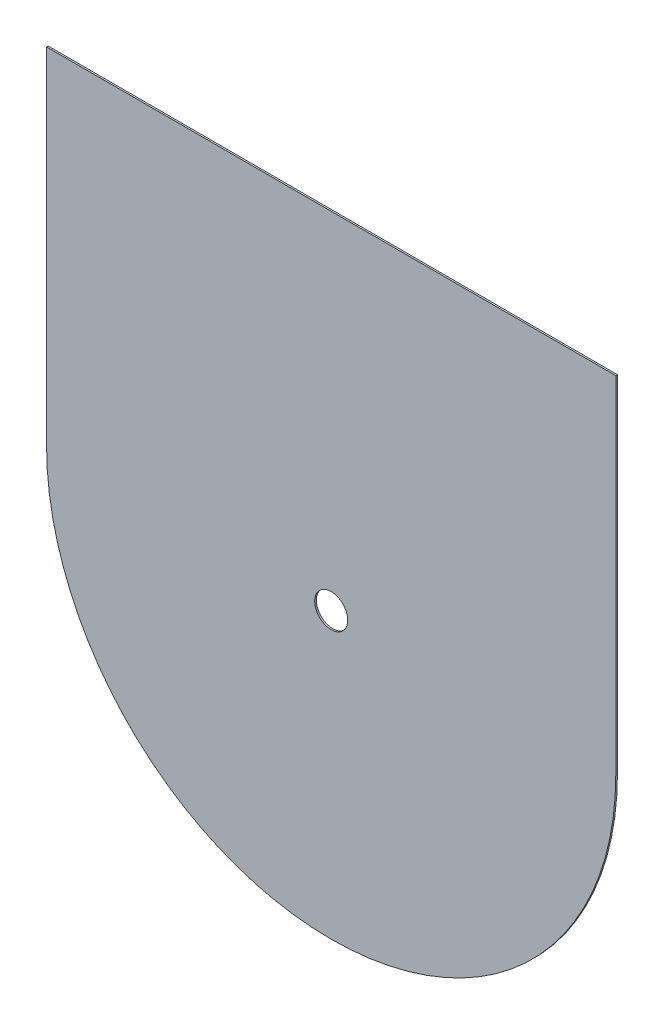
ISO-10303-21;
HEADER;
FILE_DESCRIPTION(('STEP AP214'),'2;1');
FILE_NAME('part.step','',(''),(''),'','','');
FILE_SCHEMA(('AUTOMOTIVE_DESIGN { 1 0 10303 214 1 1 1 1 }'));
ENDSEC;
DATA;
#1=APPLICATION_CONTEXT('core data for automotive mechanical design processes');
#2=APPLICATION_PROTOCOL_DEFINITION('international standard','automotive_design',2000,#1);
#3=PRODUCT_CONTEXT('',#1,'mechanical');
#4=PRODUCT('Part','Part','',(#3));
#5=PRODUCT_RELATED_PRODUCT_CATEGORY('part','',(#4));
#6=PRODUCT_DEFINITION_FORMATION('','',#4);
#7=PRODUCT_DEFINITION_CONTEXT('part definition',#1,'design');
#8=PRODUCT_DEFINITION('design','',#6,#7);
#9=PRODUCT_DEFINITION_SHAPE('','',#8);
#10=(LENGTH_UNIT() NAMED_UNIT(*) SI_UNIT(.MILLI.,.METRE.));
#11=(NAMED_UNIT(*) PLANE_ANGLE_UNIT() SI_UNIT($,.RADIAN.));
#12=(NAMED_UNIT(*) SI_UNIT($,.STERADIAN.) SOLID_ANGLE_UNIT());
#13=UNCERTAINTY_MEASURE_WITH_UNIT(LENGTH_MEASURE(1.E-05),#10,'distance_accuracy_value','');
#14=(GEOMETRIC_REPRESENTATION_CONTEXT(3) GLOBAL_UNCERTAINTY_ASSIGNED_CONTEXT((#13)) GLOBAL_UNIT_ASSIGNED_CONTEXT((#10,
#11,#12)) REPRESENTATION_CONTEXT('',''));
#15=CARTESIAN_POINT('',(0.,0.,0.));
#16=DIRECTION('',(0.,0.,1.));
#17=DIRECTION('',(1.,0.,0.));
#18=AXIS2_PLACEMENT_3D('',#15,#16,#17);
#19=CARTESIAN_POINT('',(0.,412.038787590789,2.));
#20=DIRECTION('',(0.,1.,0.));
#21=DIRECTION('',(0.,0.,1.));
#22=AXIS2_PLACEMENT_3D('',#19,#20,#21);
#23=PLANE('',#22);
#24=DIRECTION('',(1.,0.,0.));
#25=VECTOR('',#24,1.);
#26=CARTESIAN_POINT('',(0.,412.038787590789,0.));
#27=LINE('',#26,#25);
#28=CARTESIAN_POINT('',(-375.902130633059,412.038787590789,0.));
#29=VERTEX_POINT('',#28);
#30=CARTESIAN_POINT('',(313.897869366941,412.038787590789,0.));
#31=VERTEX_POINT('',#30);
#32=EDGE_CURVE('E115',#29,#31,#27,.T.);
#33=ORIENTED_EDGE('',*,*,#32,.F.);
#34=DIRECTION('',(0.,0.,-1.));
#35=VECTOR('',#34,1.);
#36=CARTESIAN_POINT('',(-375.902130633059,412.038787590789,2.));
#37=LINE('',#36,#35);
#38=CARTESIAN_POINT('',(-375.902130633059,412.038787590789,2.));
#39=VERTEX_POINT('',#38);
#40=EDGE_CURVE('E11',#39,#29,#37,.T.);
#41=ORIENTED_EDGE('',*,*,#40,.F.);
#42=DIRECTION('',(1.,0.,0.));
#43=VECTOR('',#42,1.);
#44=CARTESIAN_POINT('',(0.,412.038787590789,2.));
#45=LINE('',#44,#43);
#46=CARTESIAN_POINT('',(313.897869366941,412.038787590789,2.));
#47=VERTEX_POINT('',#46);
#48=EDGE_CURVE('E102',#39,#47,#45,.T.);
#49=ORIENTED_EDGE('',*,*,#48,.T.);
#50=DIRECTION('',(0.,0.,-1.));
#51=VECTOR('',#50,1.);
#52=CARTESIAN_POINT('',(313.897869366941,412.038787590789,2.));
#53=LINE('',#52,#51);
#54=EDGE_CURVE('E80',#47,#31,#53,.T.);
#55=ORIENTED_EDGE('',*,*,#54,.T.);
#56=EDGE_LOOP('',(#33,#41,#49,#55));
#57=FACE_BOUND('',#56,.T.);
#58=ADVANCED_FACE('F41',(#57),#23,.T.);
#59=CARTESIAN_POINT('',(-375.902130633059,0.,2.));
#60=DIRECTION('',(-1.,0.,0.));
#61=DIRECTION('',(0.,0.,1.));
#62=AXIS2_PLACEMENT_3D('',#59,#60,#61);
#63=PLANE('',#62);
#64=DIRECTION('',(0.,1.,0.));
#65=VECTOR('',#64,1.);
#66=CARTESIAN_POINT('',(-375.902130633059,0.,0.));
#67=LINE('',#66,#65);
#68=CARTESIAN_POINT('',(-375.902130633059,-7.06121240921128,0.));
#69=VERTEX_POINT('',#68);
#70=EDGE_CURVE('E93',#69,#29,#67,.T.);
#71=ORIENTED_EDGE('',*,*,#70,.F.);
#72=DIRECTION('',(0.,0.,-1.));
#73=VECTOR('',#72,1.);
#74=CARTESIAN_POINT('',(-375.902130633059,-7.06121240921128,2.));
#75=LINE('',#74,#73);
#76=CARTESIAN_POINT('',(-375.902130633059,-7.06121240921128,2.));
#77=VERTEX_POINT('',#76);
#78=EDGE_CURVE('E50',#77,#69,#75,.T.);
#79=ORIENTED_EDGE('',*,*,#78,.F.);
#80=DIRECTION('',(0.,1.,0.));
#81=VECTOR('',#80,1.);
#82=CARTESIAN_POINT('',(-375.902130633059,0.,2.));
#83=LINE('',#82,#81);
#84=EDGE_CURVE('E91',#77,#39,#83,.T.);
#85=ORIENTED_EDGE('',*,*,#84,.T.);
#86=ORIENTED_EDGE('',*,*,#40,.T.);
#87=EDGE_LOOP('',(#71,#79,#85,#86));
#88=FACE_BOUND('',#87,.T.);
#89=ADVANCED_FACE('F89',(#88),#63,.T.);
#90=CARTESIAN_POINT('',(-31.0021306330589,-7.06121240921128,2.));
#91=DIRECTION('',(0.,0.,-1.));
#92=DIRECTION('',(-1.,0.,0.));
#93=AXIS2_PLACEMENT_3D('',#90,#91,#92);
#94=CYLINDRICAL_SURFACE('',#93,344.9);
#95=CARTESIAN_POINT('',(-31.0021306330589,-7.06121240921128,0.));
#96=DIRECTION('',(0.,0.,1.));
#97=DIRECTION('',(1.,0.,0.));
#98=AXIS2_PLACEMENT_3D('',#95,#96,#97);
#99=CIRCLE('',#98,344.9);
#100=CARTESIAN_POINT('',(313.897869366941,-7.06121240921128,0.));
#101=VERTEX_POINT('',#100);
#102=EDGE_CURVE('E73',#69,#101,#99,.T.);
#103=ORIENTED_EDGE('',*,*,#102,.T.);
#104=DIRECTION('',(0.,0.,-1.));
#105=VECTOR('',#104,1.);
#106=CARTESIAN_POINT('',(313.897869366941,-7.06121240921128,2.));
#107=LINE('',#106,#105);
#108=CARTESIAN_POINT('',(313.897869366941,-7.06121240921128,2.));
#109=VERTEX_POINT('',#108);
#110=EDGE_CURVE('E95',#109,#101,#107,.T.);
#111=ORIENTED_EDGE('',*,*,#110,.F.);
#112=CARTESIAN_POINT('',(-31.0021306330589,-7.06121240921128,2.));
#113=DIRECTION('',(0.,0.,1.));
#114=DIRECTION('',(1.,0.,0.));
#115=AXIS2_PLACEMENT_3D('',#112,#113,#114);
#116=CIRCLE('',#115,344.9);
#117=EDGE_CURVE('E96',#77,#109,#116,.T.);
#118=ORIENTED_EDGE('',*,*,#117,.F.);
#119=ORIENTED_EDGE('',*,*,#78,.T.);
#120=EDGE_LOOP('',(#103,#111,#118,#119));
#121=FACE_BOUND('',#120,.T.);
#122=ADVANCED_FACE('F97',(#121),#94,.T.);
#123=CARTESIAN_POINT('',(313.897869366941,0.,2.));
#124=DIRECTION('',(-1.,0.,0.));
#125=DIRECTION('',(0.,0.,1.));
#126=AXIS2_PLACEMENT_3D('',#123,#124,#125);
#127=PLANE('',#126);
#128=DIRECTION('',(0.,1.,0.));
#129=VECTOR('',#128,1.);
#130=CARTESIAN_POINT('',(313.897869366941,0.,0.));
#131=LINE('',#130,#129);
#132=EDGE_CURVE('E123',#101,#31,#131,.T.);
#133=ORIENTED_EDGE('',*,*,#132,.T.);
#134=ORIENTED_EDGE('',*,*,#54,.F.);
#135=DIRECTION('',(0.,1.,0.));
#136=VECTOR('',#135,1.);
#137=CARTESIAN_POINT('',(313.897869366941,0.,2.));
#138=LINE('',#137,#136);
#139=EDGE_CURVE('E58',#109,#47,#138,.T.);
#140=ORIENTED_EDGE('',*,*,#139,.F.);
#141=ORIENTED_EDGE('',*,*,#110,.T.);
#142=EDGE_LOOP('',(#133,#134,#140,#141));
#143=FACE_BOUND('',#142,.T.);
#144=ADVANCED_FACE('F134',(#143),#127,.F.);
#145=CARTESIAN_POINT('',(-31.0021306330589,-7.06121240921128,2.));
#146=DIRECTION('',(0.,0.,-1.));
#147=DIRECTION('',(-1.,0.,0.));
#148=AXIS2_PLACEMENT_3D('',#145,#146,#147);
#149=CYLINDRICAL_SURFACE('',#148,20.);
#150=CARTESIAN_POINT('',(-31.0021306330589,-7.06121240921128,2.));
#151=DIRECTION('',(0.,0.,1.));
#152=DIRECTION('',(1.,0.,0.));
#153=AXIS2_PLACEMENT_3D('',#150,#151,#152);
#154=CIRCLE('',#153,20.);
#155=CARTESIAN_POINT('',(-11.0021306330589,-7.06121240921128,2.));
#156=VERTEX_POINT('',#155);
#157=EDGE_CURVE('E111',#156,#156,#154,.T.);
#158=ORIENTED_EDGE('',*,*,#157,.T.);
#159=EDGE_LOOP('',(#158));
#160=FACE_BOUND('',#159,.T.);
#161=CARTESIAN_POINT('',(-31.0021306330589,-7.06121240921128,0.));
#162=DIRECTION('',(0.,0.,1.));
#163=DIRECTION('',(1.,0.,0.));
#164=AXIS2_PLACEMENT_3D('',#161,#162,#163);
#165=CIRCLE('',#164,20.);
#166=CARTESIAN_POINT('',(-11.0021306330589,-7.06121240921128,0.));
#167=VERTEX_POINT('',#166);
#168=EDGE_CURVE('E106',#167,#167,#165,.T.);
#169=ORIENTED_EDGE('',*,*,#168,.F.);
#170=EDGE_LOOP('',(#169));
#171=FACE_BOUND('',#170,.T.);
#172=ADVANCED_FACE('F149',(#160,#171),#149,.F.);
#173=CARTESIAN_POINT('',(0.,0.,2.));
#174=DIRECTION('',(0.,0.,1.));
#175=DIRECTION('',(1.,0.,0.));
#176=AXIS2_PLACEMENT_3D('',#173,#174,#175);
#177=PLANE('',#176);
#178=ORIENTED_EDGE('',*,*,#48,.F.);
#179=ORIENTED_EDGE('',*,*,#84,.F.);
#180=ORIENTED_EDGE('',*,*,#117,.T.);
#181=ORIENTED_EDGE('',*,*,#139,.T.);
#182=EDGE_LOOP('',(#178,#179,#180,#181));
#183=FACE_BOUND('',#182,.T.);
#184=ORIENTED_EDGE('',*,*,#157,.F.);
#185=EDGE_LOOP('',(#184));
#186=FACE_BOUND('',#185,.T.);
#187=ADVANCED_FACE('F100',(#183,#186),#177,.T.);
#188=CARTESIAN_POINT('',(0.,0.,0.));
#189=DIRECTION('',(0.,0.,1.));
#190=DIRECTION('',(1.,0.,0.));
#191=AXIS2_PLACEMENT_3D('',#188,#189,#190);
#192=PLANE('',#191);
#193=ORIENTED_EDGE('',*,*,#32,.T.);
#194=ORIENTED_EDGE('',*,*,#132,.F.);
#195=ORIENTED_EDGE('',*,*,#102,.F.);
#196=ORIENTED_EDGE('',*,*,#70,.T.);
#197=EDGE_LOOP('',(#193,#194,#195,#196));
#198=FACE_BOUND('',#197,.T.);
#199=ORIENTED_EDGE('',*,*,#168,.T.);
#200=EDGE_LOOP('',(#199));
#201=FACE_BOUND('',#200,.T.);
#202=ADVANCED_FACE('F136',(#198,#201),#192,.F.);
#203=CLOSED_SHELL('',(#58,#89,#122,#144,#172,#187,#202));
#204=MANIFOLD_SOLID_BREP('B2',#203);
#205=ADVANCED_BREP_SHAPE_REPRESENTATION('',(#18,#204),#14);
#206=SHAPE_DEFINITION_REPRESENTATION(#9,#205);
ENDSEC;
END-ISO-10303-21;
